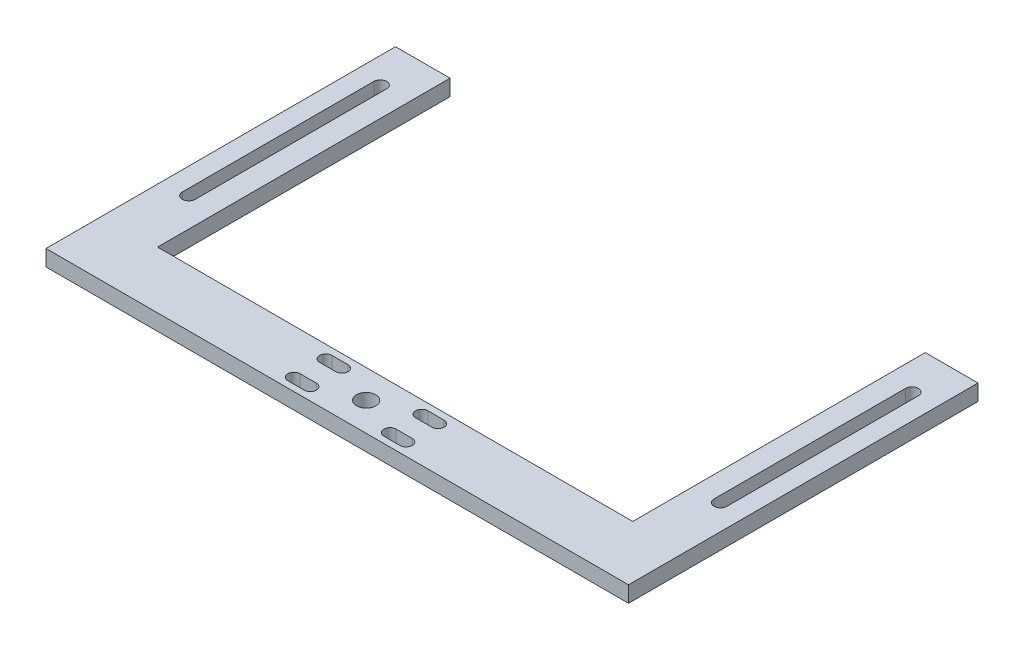
ISO-10303-21;
HEADER;
FILE_DESCRIPTION(('STEP AP214'),'2;1');
FILE_NAME('part.step','',(''),(''),'','','');
FILE_SCHEMA(('AUTOMOTIVE_DESIGN { 1 0 10303 214 1 1 1 1 }'));
ENDSEC;
DATA;
#1=APPLICATION_CONTEXT('core data for automotive mechanical design processes');
#2=APPLICATION_PROTOCOL_DEFINITION('international standard','automotive_design',2000,#1);
#3=PRODUCT_CONTEXT('',#1,'mechanical');
#4=PRODUCT('Part','Part','',(#3));
#5=PRODUCT_RELATED_PRODUCT_CATEGORY('part','',(#4));
#6=PRODUCT_DEFINITION_FORMATION('','',#4);
#7=PRODUCT_DEFINITION_CONTEXT('part definition',#1,'design');
#8=PRODUCT_DEFINITION('design','',#6,#7);
#9=PRODUCT_DEFINITION_SHAPE('','',#8);
#10=(LENGTH_UNIT() NAMED_UNIT(*) SI_UNIT(.MILLI.,.METRE.));
#11=(NAMED_UNIT(*) PLANE_ANGLE_UNIT() SI_UNIT($,.RADIAN.));
#12=(NAMED_UNIT(*) SI_UNIT($,.STERADIAN.) SOLID_ANGLE_UNIT());
#13=UNCERTAINTY_MEASURE_WITH_UNIT(LENGTH_MEASURE(1.E-05),#10,'distance_accuracy_value','');
#14=(GEOMETRIC_REPRESENTATION_CONTEXT(3) GLOBAL_UNCERTAINTY_ASSIGNED_CONTEXT((#13)) GLOBAL_UNIT_ASSIGNED_CONTEXT((#10,
#11,#12)) REPRESENTATION_CONTEXT('',''));
#15=CARTESIAN_POINT('',(0.,0.,0.));
#16=DIRECTION('',(0.,0.,1.));
#17=DIRECTION('',(1.,0.,0.));
#18=AXIS2_PLACEMENT_3D('',#15,#16,#17);
#19=CARTESIAN_POINT('',(0.,5.,36.5015102822945));
#20=DIRECTION('',(0.,0.,-1.));
#21=DIRECTION('',(-1.,0.,0.));
#22=AXIS2_PLACEMENT_3D('',#19,#20,#21);
#23=PLANE('',#22);
#24=DIRECTION('',(1.,0.,0.));
#25=VECTOR('',#24,1.);
#26=CARTESIAN_POINT('',(0.,0.,36.5015102822945));
#27=LINE('',#26,#25);
#28=CARTESIAN_POINT('',(-103.043555275164,0.,36.5015102822945));
#29=VERTEX_POINT('',#28);
#30=CARTESIAN_POINT('',(78.4778435266556,0.,36.5015102822945));
#31=VERTEX_POINT('',#30);
#32=EDGE_CURVE('E468',#29,#31,#27,.T.);
#33=ORIENTED_EDGE('',*,*,#32,.T.);
#34=DIRECTION('',(0.,-1.,0.));
#35=VECTOR('',#34,1.);
#36=CARTESIAN_POINT('',(78.4778435266556,5.,36.5015102822945));
#37=LINE('',#36,#35);
#38=CARTESIAN_POINT('',(78.4778435266556,5.,36.5015102822945));
#39=VERTEX_POINT('',#38);
#40=EDGE_CURVE('E344',#39,#31,#37,.T.);
#41=ORIENTED_EDGE('',*,*,#40,.F.);
#42=DIRECTION('',(1.,0.,0.));
#43=VECTOR('',#42,1.);
#44=CARTESIAN_POINT('',(0.,5.,36.5015102822945));
#45=LINE('',#44,#43);
#46=CARTESIAN_POINT('',(-103.043555275164,5.,36.5015102822945));
#47=VERTEX_POINT('',#46);
#48=EDGE_CURVE('E427',#47,#39,#45,.T.);
#49=ORIENTED_EDGE('',*,*,#48,.F.);
#50=DIRECTION('',(0.,-1.,0.));
#51=VECTOR('',#50,1.);
#52=CARTESIAN_POINT('',(-103.043555275164,5.,36.5015102822945));
#53=LINE('',#52,#51);
#54=EDGE_CURVE('E387',#47,#29,#53,.T.);
#55=ORIENTED_EDGE('',*,*,#54,.T.);
#56=EDGE_LOOP('',(#33,#41,#49,#55));
#57=FACE_BOUND('',#56,.T.);
#58=ADVANCED_FACE('F95',(#57),#23,.F.);
#59=CARTESIAN_POINT('',(-12.1835686365529,5.,27.5951584174138));
#60=DIRECTION('',(0.,-1.,0.));
#61=DIRECTION('',(0.,0.,-1.));
#62=AXIS2_PLACEMENT_3D('',#59,#60,#61);
#63=CYLINDRICAL_SURFACE('',#62,3.);
#64=CARTESIAN_POINT('',(-12.1835686365529,5.,27.5951584174138));
#65=DIRECTION('',(0.,1.,0.));
#66=DIRECTION('',(0.,0.,1.));
#67=AXIS2_PLACEMENT_3D('',#64,#65,#66);
#68=CIRCLE('',#67,3.);
#69=CARTESIAN_POINT('',(-12.1835686365529,5.,30.5951584174139));
#70=VERTEX_POINT('',#69);
#71=EDGE_CURVE('E549',#70,#70,#68,.T.);
#72=ORIENTED_EDGE('',*,*,#71,.T.);
#73=EDGE_LOOP('',(#72));
#74=FACE_BOUND('',#73,.T.);
#75=CARTESIAN_POINT('',(-12.1835686365529,0.,27.5951584174138));
#76=DIRECTION('',(0.,1.,0.));
#77=DIRECTION('',(0.,0.,1.));
#78=AXIS2_PLACEMENT_3D('',#75,#76,#77);
#79=CIRCLE('',#78,3.);
#80=CARTESIAN_POINT('',(-12.1835686365529,0.,30.5951584174139));
#81=VERTEX_POINT('',#80);
#82=EDGE_CURVE('E476',#81,#81,#79,.T.);
#83=ORIENTED_EDGE('',*,*,#82,.F.);
#84=EDGE_LOOP('',(#83));
#85=FACE_BOUND('',#84,.T.);
#86=ADVANCED_FACE('F730',(#74,#85),#63,.F.);
#87=CARTESIAN_POINT('',(0.,5.,20.8098805284228));
#88=DIRECTION('',(0.,0.,-1.));
#89=DIRECTION('',(-1.,0.,0.));
#90=AXIS2_PLACEMENT_3D('',#87,#88,#89);
#91=PLANE('',#90);
#92=DIRECTION('',(1.,0.,0.));
#93=VECTOR('',#92,1.);
#94=CARTESIAN_POINT('',(0.,0.,20.8098805284228));
#95=LINE('',#94,#93);
#96=CARTESIAN_POINT('',(-29.6663123654557,0.,20.8098805284228));
#97=VERTEX_POINT('',#96);
#98=CARTESIAN_POINT('',(-24.5966822269551,0.,20.8098805284228));
#99=VERTEX_POINT('',#98);
#100=EDGE_CURVE('E480',#97,#99,#95,.T.);
#101=ORIENTED_EDGE('',*,*,#100,.T.);
#102=DIRECTION('',(0.,-1.,0.));
#103=VECTOR('',#102,1.);
#104=CARTESIAN_POINT('',(-24.5966822269551,5.,20.8098805284228));
#105=LINE('',#104,#103);
#106=CARTESIAN_POINT('',(-24.5966822269551,5.,20.8098805284228));
#107=VERTEX_POINT('',#106);
#108=EDGE_CURVE('E443',#107,#99,#105,.T.);
#109=ORIENTED_EDGE('',*,*,#108,.F.);
#110=DIRECTION('',(1.,0.,0.));
#111=VECTOR('',#110,1.);
#112=CARTESIAN_POINT('',(0.,5.,20.8098805284228));
#113=LINE('',#112,#111);
#114=CARTESIAN_POINT('',(-29.6663123654557,5.,20.8098805284228));
#115=VERTEX_POINT('',#114);
#116=EDGE_CURVE('E553',#115,#107,#113,.T.);
#117=ORIENTED_EDGE('',*,*,#116,.F.);
#118=DIRECTION('',(0.,-1.,0.));
#119=VECTOR('',#118,1.);
#120=CARTESIAN_POINT('',(-29.6663123654557,5.,20.8098805284228));
#121=LINE('',#120,#119);
#122=EDGE_CURVE('E459',#115,#97,#121,.T.);
#123=ORIENTED_EDGE('',*,*,#122,.T.);
#124=EDGE_LOOP('',(#101,#109,#117,#123));
#125=FACE_BOUND('',#124,.T.);
#126=ADVANCED_FACE('F733',(#125),#91,.F.);
#127=CARTESIAN_POINT('',(-29.6663123654557,5.,22.7104109484229));
#128=DIRECTION('',(0.,-1.,0.));
#129=DIRECTION('',(0.,0.,-1.));
#130=AXIS2_PLACEMENT_3D('',#127,#128,#129);
#131=CYLINDRICAL_SURFACE('',#130,1.90053042);
#132=CARTESIAN_POINT('',(-29.6663123654557,0.,22.7104109484229));
#133=DIRECTION('',(0.,1.,0.));
#134=DIRECTION('',(0.,0.,1.));
#135=AXIS2_PLACEMENT_3D('',#132,#133,#134);
#136=CIRCLE('',#135,1.90053042);
#137=CARTESIAN_POINT('',(-29.6663123654557,0.,24.6109413684229));
#138=VERTEX_POINT('',#137);
#139=EDGE_CURVE('E484',#97,#138,#136,.T.);
#140=ORIENTED_EDGE('',*,*,#139,.F.);
#141=ORIENTED_EDGE('',*,*,#122,.F.);
#142=CARTESIAN_POINT('',(-29.6663123654557,5.,22.7104109484229));
#143=DIRECTION('',(0.,1.,0.));
#144=DIRECTION('',(0.,0.,1.));
#145=AXIS2_PLACEMENT_3D('',#142,#143,#144);
#146=CIRCLE('',#145,1.90053042);
#147=CARTESIAN_POINT('',(-29.6663123654557,5.,24.6109413684229));
#148=VERTEX_POINT('',#147);
#149=EDGE_CURVE('E556',#115,#148,#146,.T.);
#150=ORIENTED_EDGE('',*,*,#149,.T.);
#151=DIRECTION('',(0.,-1.,0.));
#152=VECTOR('',#151,1.);
#153=CARTESIAN_POINT('',(-29.6663123654557,5.,24.6109413684229));
#154=LINE('',#153,#152);
#155=EDGE_CURVE('E456',#148,#138,#154,.T.);
#156=ORIENTED_EDGE('',*,*,#155,.T.);
#157=EDGE_LOOP('',(#140,#141,#150,#156));
#158=FACE_BOUND('',#157,.T.);
#159=ADVANCED_FACE('F737',(#158),#131,.F.);
#160=CARTESIAN_POINT('',(0.,5.,24.6109413684229));
#161=DIRECTION('',(0.,0.,-1.));
#162=DIRECTION('',(-1.,0.,0.));
#163=AXIS2_PLACEMENT_3D('',#160,#161,#162);
#164=PLANE('',#163);
#165=DIRECTION('',(1.,0.,0.));
#166=VECTOR('',#165,1.);
#167=CARTESIAN_POINT('',(0.,0.,24.6109413684229));
#168=LINE('',#167,#166);
#169=CARTESIAN_POINT('',(-24.5966822269551,0.,24.6109413684229));
#170=VERTEX_POINT('',#169);
#171=EDGE_CURVE('E488',#138,#170,#168,.T.);
#172=ORIENTED_EDGE('',*,*,#171,.F.);
#173=ORIENTED_EDGE('',*,*,#155,.F.);
#174=DIRECTION('',(1.,0.,0.));
#175=VECTOR('',#174,1.);
#176=CARTESIAN_POINT('',(0.,5.,24.6109413684229));
#177=LINE('',#176,#175);
#178=CARTESIAN_POINT('',(-24.5966822269551,5.,24.6109413684229));
#179=VERTEX_POINT('',#178);
#180=EDGE_CURVE('E560',#148,#179,#177,.T.);
#181=ORIENTED_EDGE('',*,*,#180,.T.);
#182=DIRECTION('',(0.,-1.,0.));
#183=VECTOR('',#182,1.);
#184=CARTESIAN_POINT('',(-24.5966822269551,5.,24.6109413684229));
#185=LINE('',#184,#183);
#186=EDGE_CURVE('E452',#179,#170,#185,.T.);
#187=ORIENTED_EDGE('',*,*,#186,.T.);
#188=EDGE_LOOP('',(#172,#173,#181,#187));
#189=FACE_BOUND('',#188,.T.);
#190=ADVANCED_FACE('F741',(#189),#164,.T.);
#191=CARTESIAN_POINT('',(-24.5966822269551,5.,22.7104109484229));
#192=DIRECTION('',(0.,-1.,0.));
#193=DIRECTION('',(0.,0.,-1.));
#194=AXIS2_PLACEMENT_3D('',#191,#192,#193);
#195=CYLINDRICAL_SURFACE('',#194,1.90053042);
#196=CARTESIAN_POINT('',(-24.5966822269551,0.,22.7104109484229));
#197=DIRECTION('',(0.,1.,0.));
#198=DIRECTION('',(0.,0.,1.));
#199=AXIS2_PLACEMENT_3D('',#196,#197,#198);
#200=CIRCLE('',#199,1.90053042);
#201=EDGE_CURVE('E492',#170,#99,#200,.T.);
#202=ORIENTED_EDGE('',*,*,#201,.F.);
#203=ORIENTED_EDGE('',*,*,#186,.F.);
#204=CARTESIAN_POINT('',(-24.5966822269551,5.,22.7104109484229));
#205=DIRECTION('',(0.,1.,0.));
#206=DIRECTION('',(0.,0.,1.));
#207=AXIS2_PLACEMENT_3D('',#204,#205,#206);
#208=CIRCLE('',#207,1.90053042);
#209=EDGE_CURVE('E564',#179,#107,#208,.T.);
#210=ORIENTED_EDGE('',*,*,#209,.T.);
#211=ORIENTED_EDGE('',*,*,#108,.T.);
#212=EDGE_LOOP('',(#202,#203,#210,#211));
#213=FACE_BOUND('',#212,.T.);
#214=ADVANCED_FACE('F745',(#213),#195,.F.);
#215=CARTESIAN_POINT('',(0.,5.,30.7093754650346));
#216=DIRECTION('',(0.,0.,-1.));
#217=DIRECTION('',(-1.,0.,0.));
#218=AXIS2_PLACEMENT_3D('',#215,#216,#217);
#219=PLANE('',#218);
#220=DIRECTION('',(1.,0.,0.));
#221=VECTOR('',#220,1.);
#222=CARTESIAN_POINT('',(0.,0.,30.7093754650346));
#223=LINE('',#222,#221);
#224=CARTESIAN_POINT('',(-29.666312365455,0.,30.7093754650346));
#225=VERTEX_POINT('',#224);
#226=CARTESIAN_POINT('',(-24.5966822269544,0.,30.7093754650346));
#227=VERTEX_POINT('',#226);
#228=EDGE_CURVE('E496',#225,#227,#223,.T.);
#229=ORIENTED_EDGE('',*,*,#228,.T.);
#230=DIRECTION('',(0.,-1.,0.));
#231=VECTOR('',#230,1.);
#232=CARTESIAN_POINT('',(-24.5966822269544,5.,30.7093754650346));
#233=LINE('',#232,#231);
#234=CARTESIAN_POINT('',(-24.5966822269544,5.,30.7093754650346));
#235=VERTEX_POINT('',#234);
#236=EDGE_CURVE('E431',#235,#227,#233,.T.);
#237=ORIENTED_EDGE('',*,*,#236,.F.);
#238=DIRECTION('',(1.,0.,0.));
#239=VECTOR('',#238,1.);
#240=CARTESIAN_POINT('',(0.,5.,30.7093754650346));
#241=LINE('',#240,#239);
#242=CARTESIAN_POINT('',(-29.666312365455,5.,30.7093754650346));
#243=VERTEX_POINT('',#242);
#244=EDGE_CURVE('E568',#243,#235,#241,.T.);
#245=ORIENTED_EDGE('',*,*,#244,.F.);
#246=DIRECTION('',(0.,-1.,0.));
#247=VECTOR('',#246,1.);
#248=CARTESIAN_POINT('',(-29.666312365455,5.,30.7093754650346));
#249=LINE('',#248,#247);
#250=EDGE_CURVE('E447',#243,#225,#249,.T.);
#251=ORIENTED_EDGE('',*,*,#250,.T.);
#252=EDGE_LOOP('',(#229,#237,#245,#251));
#253=FACE_BOUND('',#252,.T.);
#254=ADVANCED_FACE('F749',(#253),#219,.F.);
#255=CARTESIAN_POINT('',(-29.666312365455,5.,32.6093754650345));
#256=DIRECTION('',(0.,-1.,0.));
#257=DIRECTION('',(0.,0.,-1.));
#258=AXIS2_PLACEMENT_3D('',#255,#256,#257);
#259=CYLINDRICAL_SURFACE('',#258,1.9);
#260=CARTESIAN_POINT('',(-29.666312365455,0.,32.6093754650345));
#261=DIRECTION('',(0.,1.,0.));
#262=DIRECTION('',(0.,0.,1.));
#263=AXIS2_PLACEMENT_3D('',#260,#261,#262);
#264=CIRCLE('',#263,1.9);
#265=CARTESIAN_POINT('',(-29.666312365455,0.,34.5093754650345));
#266=VERTEX_POINT('',#265);
#267=EDGE_CURVE('E500',#225,#266,#264,.T.);
#268=ORIENTED_EDGE('',*,*,#267,.F.);
#269=ORIENTED_EDGE('',*,*,#250,.F.);
#270=CARTESIAN_POINT('',(-29.666312365455,5.,32.6093754650345));
#271=DIRECTION('',(0.,1.,0.));
#272=DIRECTION('',(0.,0.,1.));
#273=AXIS2_PLACEMENT_3D('',#270,#271,#272);
#274=CIRCLE('',#273,1.9);
#275=CARTESIAN_POINT('',(-29.666312365455,5.,34.5093754650345));
#276=VERTEX_POINT('',#275);
#277=EDGE_CURVE('E571',#243,#276,#274,.T.);
#278=ORIENTED_EDGE('',*,*,#277,.T.);
#279=DIRECTION('',(0.,-1.,0.));
#280=VECTOR('',#279,1.);
#281=CARTESIAN_POINT('',(-29.666312365455,5.,34.5093754650345));
#282=LINE('',#281,#280);
#283=EDGE_CURVE('E444',#276,#266,#282,.T.);
#284=ORIENTED_EDGE('',*,*,#283,.T.);
#285=EDGE_LOOP('',(#268,#269,#278,#284));
#286=FACE_BOUND('',#285,.T.);
#287=ADVANCED_FACE('F753',(#286),#259,.F.);
#288=CARTESIAN_POINT('',(0.,5.,34.5093754650345));
#289=DIRECTION('',(0.,0.,-1.));
#290=DIRECTION('',(-1.,0.,0.));
#291=AXIS2_PLACEMENT_3D('',#288,#289,#290);
#292=PLANE('',#291);
#293=DIRECTION('',(1.,0.,0.));
#294=VECTOR('',#293,1.);
#295=CARTESIAN_POINT('',(0.,0.,34.5093754650345));
#296=LINE('',#295,#294);
#297=CARTESIAN_POINT('',(-24.5966822269544,0.,34.5093754650345));
#298=VERTEX_POINT('',#297);
#299=EDGE_CURVE('E504',#266,#298,#296,.T.);
#300=ORIENTED_EDGE('',*,*,#299,.F.);
#301=ORIENTED_EDGE('',*,*,#283,.F.);
#302=DIRECTION('',(1.,0.,0.));
#303=VECTOR('',#302,1.);
#304=CARTESIAN_POINT('',(0.,5.,34.5093754650345));
#305=LINE('',#304,#303);
#306=CARTESIAN_POINT('',(-24.5966822269544,5.,34.5093754650345));
#307=VERTEX_POINT('',#306);
#308=EDGE_CURVE('E575',#276,#307,#305,.T.);
#309=ORIENTED_EDGE('',*,*,#308,.T.);
#310=DIRECTION('',(0.,-1.,0.));
#311=VECTOR('',#310,1.);
#312=CARTESIAN_POINT('',(-24.5966822269544,5.,34.5093754650345));
#313=LINE('',#312,#311);
#314=EDGE_CURVE('E440',#307,#298,#313,.T.);
#315=ORIENTED_EDGE('',*,*,#314,.T.);
#316=EDGE_LOOP('',(#300,#301,#309,#315));
#317=FACE_BOUND('',#316,.T.);
#318=ADVANCED_FACE('F757',(#317),#292,.T.);
#319=CARTESIAN_POINT('',(-24.5966822269544,5.,32.6093754650345));
#320=DIRECTION('',(0.,-1.,0.));
#321=DIRECTION('',(0.,0.,-1.));
#322=AXIS2_PLACEMENT_3D('',#319,#320,#321);
#323=CYLINDRICAL_SURFACE('',#322,1.9);
#324=CARTESIAN_POINT('',(-24.5966822269544,0.,32.6093754650345));
#325=DIRECTION('',(0.,1.,0.));
#326=DIRECTION('',(0.,0.,1.));
#327=AXIS2_PLACEMENT_3D('',#324,#325,#326);
#328=CIRCLE('',#327,1.9);
#329=EDGE_CURVE('E508',#298,#227,#328,.T.);
#330=ORIENTED_EDGE('',*,*,#329,.F.);
#331=ORIENTED_EDGE('',*,*,#314,.F.);
#332=CARTESIAN_POINT('',(-24.5966822269544,5.,32.6093754650345));
#333=DIRECTION('',(0.,1.,0.));
#334=DIRECTION('',(0.,0.,1.));
#335=AXIS2_PLACEMENT_3D('',#332,#333,#334);
#336=CIRCLE('',#335,1.9);
#337=EDGE_CURVE('E579',#307,#235,#336,.T.);
#338=ORIENTED_EDGE('',*,*,#337,.T.);
#339=ORIENTED_EDGE('',*,*,#236,.T.);
#340=EDGE_LOOP('',(#330,#331,#338,#339));
#341=FACE_BOUND('',#340,.T.);
#342=ADVANCED_FACE('F761',(#341),#323,.F.);
#343=CARTESIAN_POINT('',(0.,5.,20.809880528422));
#344=DIRECTION('',(0.,0.,-1.));
#345=DIRECTION('',(-1.,0.,0.));
#346=AXIS2_PLACEMENT_3D('',#343,#344,#345);
#347=PLANE('',#346);
#348=DIRECTION('',(1.,0.,0.));
#349=VECTOR('',#348,1.);
#350=CARTESIAN_POINT('',(0.,0.,20.809880528422));
#351=LINE('',#350,#349);
#352=CARTESIAN_POINT('',(0.23318257115589,0.,20.809880528422));
#353=VERTEX_POINT('',#352);
#354=CARTESIAN_POINT('',(5.3028127096565,0.,20.809880528422));
#355=VERTEX_POINT('',#354);
#356=EDGE_CURVE('E512',#353,#355,#351,.T.);
#357=ORIENTED_EDGE('',*,*,#356,.T.);
#358=DIRECTION('',(0.,-1.,0.));
#359=VECTOR('',#358,1.);
#360=CARTESIAN_POINT('',(5.3028127096565,5.,20.809880528422));
#361=LINE('',#360,#359);
#362=CARTESIAN_POINT('',(5.3028127096565,5.,20.809880528422));
#363=VERTEX_POINT('',#362);
#364=EDGE_CURVE('E417',#363,#355,#361,.T.);
#365=ORIENTED_EDGE('',*,*,#364,.F.);
#366=DIRECTION('',(1.,0.,0.));
#367=VECTOR('',#366,1.);
#368=CARTESIAN_POINT('',(0.,5.,20.809880528422));
#369=LINE('',#368,#367);
#370=CARTESIAN_POINT('',(0.23318257115589,5.,20.809880528422));
#371=VERTEX_POINT('',#370);
#372=EDGE_CURVE('E583',#371,#363,#369,.T.);
#373=ORIENTED_EDGE('',*,*,#372,.F.);
#374=DIRECTION('',(0.,-1.,0.));
#375=VECTOR('',#374,1.);
#376=CARTESIAN_POINT('',(0.23318257115589,5.,20.809880528422));
#377=LINE('',#376,#375);
#378=EDGE_CURVE('E435',#371,#353,#377,.T.);
#379=ORIENTED_EDGE('',*,*,#378,.T.);
#380=EDGE_LOOP('',(#357,#365,#373,#379));
#381=FACE_BOUND('',#380,.T.);
#382=ADVANCED_FACE('F765',(#381),#347,.F.);
#383=CARTESIAN_POINT('',(0.23318257115589,5.,22.709880528422));
#384=DIRECTION('',(0.,-1.,0.));
#385=DIRECTION('',(0.,0.,-1.));
#386=AXIS2_PLACEMENT_3D('',#383,#384,#385);
#387=CYLINDRICAL_SURFACE('',#386,1.9);
#388=CARTESIAN_POINT('',(0.23318257115589,0.,22.709880528422));
#389=DIRECTION('',(0.,1.,0.));
#390=DIRECTION('',(0.,0.,1.));
#391=AXIS2_PLACEMENT_3D('',#388,#389,#390);
#392=CIRCLE('',#391,1.9);
#393=CARTESIAN_POINT('',(0.23318257115589,0.,24.609880528422));
#394=VERTEX_POINT('',#393);
#395=EDGE_CURVE('E516',#353,#394,#392,.T.);
#396=ORIENTED_EDGE('',*,*,#395,.F.);
#397=ORIENTED_EDGE('',*,*,#378,.F.);
#398=CARTESIAN_POINT('',(0.23318257115589,5.,22.709880528422));
#399=DIRECTION('',(0.,1.,0.));
#400=DIRECTION('',(0.,0.,1.));
#401=AXIS2_PLACEMENT_3D('',#398,#399,#400);
#402=CIRCLE('',#401,1.9);
#403=CARTESIAN_POINT('',(0.23318257115589,5.,24.609880528422));
#404=VERTEX_POINT('',#403);
#405=EDGE_CURVE('E586',#371,#404,#402,.T.);
#406=ORIENTED_EDGE('',*,*,#405,.T.);
#407=DIRECTION('',(0.,-1.,0.));
#408=VECTOR('',#407,1.);
#409=CARTESIAN_POINT('',(0.23318257115589,5.,24.609880528422));
#410=LINE('',#409,#408);
#411=EDGE_CURVE('E432',#404,#394,#410,.T.);
#412=ORIENTED_EDGE('',*,*,#411,.T.);
#413=EDGE_LOOP('',(#396,#397,#406,#412));
#414=FACE_BOUND('',#413,.T.);
#415=ADVANCED_FACE('F769',(#414),#387,.F.);
#416=CARTESIAN_POINT('',(0.,5.,24.609880528422));
#417=DIRECTION('',(0.,0.,-1.));
#418=DIRECTION('',(-1.,0.,0.));
#419=AXIS2_PLACEMENT_3D('',#416,#417,#418);
#420=PLANE('',#419);
#421=DIRECTION('',(1.,0.,0.));
#422=VECTOR('',#421,1.);
#423=CARTESIAN_POINT('',(0.,0.,24.609880528422));
#424=LINE('',#423,#422);
#425=CARTESIAN_POINT('',(5.3028127096565,0.,24.609880528422));
#426=VERTEX_POINT('',#425);
#427=EDGE_CURVE('E520',#394,#426,#424,.T.);
#428=ORIENTED_EDGE('',*,*,#427,.F.);
#429=ORIENTED_EDGE('',*,*,#411,.F.);
#430=DIRECTION('',(1.,0.,0.));
#431=VECTOR('',#430,1.);
#432=CARTESIAN_POINT('',(0.,5.,24.609880528422));
#433=LINE('',#432,#431);
#434=CARTESIAN_POINT('',(5.3028127096565,5.,24.609880528422));
#435=VERTEX_POINT('',#434);
#436=EDGE_CURVE('E590',#404,#435,#433,.T.);
#437=ORIENTED_EDGE('',*,*,#436,.T.);
#438=DIRECTION('',(0.,-1.,0.));
#439=VECTOR('',#438,1.);
#440=CARTESIAN_POINT('',(5.3028127096565,5.,24.609880528422));
#441=LINE('',#440,#439);
#442=EDGE_CURVE('E428',#435,#426,#441,.T.);
#443=ORIENTED_EDGE('',*,*,#442,.T.);
#444=EDGE_LOOP('',(#428,#429,#437,#443));
#445=FACE_BOUND('',#444,.T.);
#446=ADVANCED_FACE('F773',(#445),#420,.T.);
#447=CARTESIAN_POINT('',(5.3028127096565,5.,22.709880528422));
#448=DIRECTION('',(0.,-1.,0.));
#449=DIRECTION('',(0.,0.,-1.));
#450=AXIS2_PLACEMENT_3D('',#447,#448,#449);
#451=CYLINDRICAL_SURFACE('',#450,1.9);
#452=CARTESIAN_POINT('',(5.3028127096565,0.,22.709880528422));
#453=DIRECTION('',(0.,1.,0.));
#454=DIRECTION('',(0.,0.,1.));
#455=AXIS2_PLACEMENT_3D('',#452,#453,#454);
#456=CIRCLE('',#455,1.9);
#457=EDGE_CURVE('E524',#426,#355,#456,.T.);
#458=ORIENTED_EDGE('',*,*,#457,.F.);
#459=ORIENTED_EDGE('',*,*,#442,.F.);
#460=CARTESIAN_POINT('',(5.3028127096565,5.,22.709880528422));
#461=DIRECTION('',(0.,1.,0.));
#462=DIRECTION('',(0.,0.,1.));
#463=AXIS2_PLACEMENT_3D('',#460,#461,#462);
#464=CIRCLE('',#463,1.9);
#465=EDGE_CURVE('E594',#435,#363,#464,.T.);
#466=ORIENTED_EDGE('',*,*,#465,.T.);
#467=ORIENTED_EDGE('',*,*,#364,.T.);
#468=EDGE_LOOP('',(#458,#459,#466,#467));
#469=FACE_BOUND('',#468,.T.);
#470=ADVANCED_FACE('F777',(#469),#451,.F.);
#471=CARTESIAN_POINT('',(0.,5.,30.7093754650337));
#472=DIRECTION('',(0.,0.,-1.));
#473=DIRECTION('',(-1.,0.,0.));
#474=AXIS2_PLACEMENT_3D('',#471,#472,#473);
#475=PLANE('',#474);
#476=DIRECTION('',(1.,0.,0.));
#477=VECTOR('',#476,1.);
#478=CARTESIAN_POINT('',(0.,0.,30.7093754650337));
#479=LINE('',#478,#477);
#480=CARTESIAN_POINT('',(0.233182571156695,0.,30.7093754650337));
#481=VERTEX_POINT('',#480);
#482=CARTESIAN_POINT('',(5.30281270965731,0.,30.7093754650337));
#483=VERTEX_POINT('',#482);
#484=EDGE_CURVE('E528',#481,#483,#479,.T.);
#485=ORIENTED_EDGE('',*,*,#484,.T.);
#486=DIRECTION('',(0.,-1.,0.));
#487=VECTOR('',#486,1.);
#488=CARTESIAN_POINT('',(5.30281270965731,5.,30.7093754650337));
#489=LINE('',#488,#487);
#490=CARTESIAN_POINT('',(5.30281270965731,5.,30.7093754650337));
#491=VERTEX_POINT('',#490);
#492=EDGE_CURVE('E424',#491,#483,#489,.T.);
#493=ORIENTED_EDGE('',*,*,#492,.F.);
#494=DIRECTION('',(1.,0.,0.));
#495=VECTOR('',#494,1.);
#496=CARTESIAN_POINT('',(0.,5.,30.7093754650337));
#497=LINE('',#496,#495);
#498=CARTESIAN_POINT('',(0.233182571156695,5.,30.7093754650337));
#499=VERTEX_POINT('',#498);
#500=EDGE_CURVE('E598',#499,#491,#497,.T.);
#501=ORIENTED_EDGE('',*,*,#500,.F.);
#502=DIRECTION('',(0.,-1.,0.));
#503=VECTOR('',#502,1.);
#504=CARTESIAN_POINT('',(0.233182571156695,5.,30.7093754650337));
#505=LINE('',#504,#503);
#506=EDGE_CURVE('E421',#499,#481,#505,.T.);
#507=ORIENTED_EDGE('',*,*,#506,.T.);
#508=EDGE_LOOP('',(#485,#493,#501,#507));
#509=FACE_BOUND('',#508,.T.);
#510=ADVANCED_FACE('F781',(#509),#475,.F.);
#511=CARTESIAN_POINT('',(0.233182571156695,5.,32.6093754650337));
#512=DIRECTION('',(0.,-1.,0.));
#513=DIRECTION('',(0.,0.,-1.));
#514=AXIS2_PLACEMENT_3D('',#511,#512,#513);
#515=CYLINDRICAL_SURFACE('',#514,1.9);
#516=CARTESIAN_POINT('',(0.233182571156695,0.,32.6093754650337));
#517=DIRECTION('',(0.,1.,0.));
#518=DIRECTION('',(0.,0.,1.));
#519=AXIS2_PLACEMENT_3D('',#516,#517,#518);
#520=CIRCLE('',#519,1.9);
#521=CARTESIAN_POINT('',(0.233182571156695,0.,34.5093754650337));
#522=VERTEX_POINT('',#521);
#523=EDGE_CURVE('E532',#481,#522,#520,.T.);
#524=ORIENTED_EDGE('',*,*,#523,.F.);
#525=ORIENTED_EDGE('',*,*,#506,.F.);
#526=CARTESIAN_POINT('',(0.233182571156695,5.,32.6093754650337));
#527=DIRECTION('',(0.,1.,0.));
#528=DIRECTION('',(0.,0.,1.));
#529=AXIS2_PLACEMENT_3D('',#526,#527,#528);
#530=CIRCLE('',#529,1.9);
#531=CARTESIAN_POINT('',(0.233182571156695,5.,34.5093754650337));
#532=VERTEX_POINT('',#531);
#533=EDGE_CURVE('E601',#499,#532,#530,.T.);
#534=ORIENTED_EDGE('',*,*,#533,.T.);
#535=DIRECTION('',(0.,-1.,0.));
#536=VECTOR('',#535,1.);
#537=CARTESIAN_POINT('',(0.233182571156695,5.,34.5093754650337));
#538=LINE('',#537,#536);
#539=EDGE_CURVE('E418',#532,#522,#538,.T.);
#540=ORIENTED_EDGE('',*,*,#539,.T.);
#541=EDGE_LOOP('',(#524,#525,#534,#540));
#542=FACE_BOUND('',#541,.T.);
#543=ADVANCED_FACE('F785',(#542),#515,.F.);
#544=CARTESIAN_POINT('',(0.,5.,34.5093754650337));
#545=DIRECTION('',(0.,0.,-1.));
#546=DIRECTION('',(-1.,0.,0.));
#547=AXIS2_PLACEMENT_3D('',#544,#545,#546);
#548=PLANE('',#547);
#549=DIRECTION('',(1.,0.,0.));
#550=VECTOR('',#549,1.);
#551=CARTESIAN_POINT('',(0.,0.,34.5093754650337));
#552=LINE('',#551,#550);
#553=CARTESIAN_POINT('',(5.30281270965731,0.,34.5093754650337));
#554=VERTEX_POINT('',#553);
#555=EDGE_CURVE('E536',#522,#554,#552,.T.);
#556=ORIENTED_EDGE('',*,*,#555,.F.);
#557=ORIENTED_EDGE('',*,*,#539,.F.);
#558=DIRECTION('',(1.,0.,0.));
#559=VECTOR('',#558,1.);
#560=CARTESIAN_POINT('',(0.,5.,34.5093754650337));
#561=LINE('',#560,#559);
#562=CARTESIAN_POINT('',(5.30281270965731,5.,34.5093754650337));
#563=VERTEX_POINT('',#562);
#564=EDGE_CURVE('E605',#532,#563,#561,.T.);
#565=ORIENTED_EDGE('',*,*,#564,.T.);
#566=DIRECTION('',(0.,-1.,0.));
#567=VECTOR('',#566,1.);
#568=CARTESIAN_POINT('',(5.30281270965731,5.,34.5093754650337));
#569=LINE('',#568,#567);
#570=EDGE_CURVE('E414',#563,#554,#569,.T.);
#571=ORIENTED_EDGE('',*,*,#570,.T.);
#572=EDGE_LOOP('',(#556,#557,#565,#571));
#573=FACE_BOUND('',#572,.T.);
#574=ADVANCED_FACE('F789',(#573),#548,.T.);
#575=CARTESIAN_POINT('',(5.30281270965731,5.,32.6093754650337));
#576=DIRECTION('',(0.,-1.,0.));
#577=DIRECTION('',(0.,0.,-1.));
#578=AXIS2_PLACEMENT_3D('',#575,#576,#577);
#579=CYLINDRICAL_SURFACE('',#578,1.9);
#580=CARTESIAN_POINT('',(5.30281270965731,0.,32.6093754650337));
#581=DIRECTION('',(0.,1.,0.));
#582=DIRECTION('',(0.,0.,1.));
#583=AXIS2_PLACEMENT_3D('',#580,#581,#582);
#584=CIRCLE('',#583,1.9);
#585=EDGE_CURVE('E383',#554,#483,#584,.T.);
#586=ORIENTED_EDGE('',*,*,#585,.F.);
#587=ORIENTED_EDGE('',*,*,#570,.F.);
#588=CARTESIAN_POINT('',(5.30281270965731,5.,32.6093754650337));
#589=DIRECTION('',(0.,1.,0.));
#590=DIRECTION('',(0.,0.,1.));
#591=AXIS2_PLACEMENT_3D('',#588,#589,#590);
#592=CIRCLE('',#591,1.9);
#593=EDGE_CURVE('E471',#563,#491,#592,.T.);
#594=ORIENTED_EDGE('',*,*,#593,.T.);
#595=ORIENTED_EDGE('',*,*,#492,.T.);
#596=EDGE_LOOP('',(#586,#587,#594,#595));
#597=FACE_BOUND('',#596,.T.);
#598=ADVANCED_FACE('F793',(#597),#579,.F.);
#599=CARTESIAN_POINT('',(0.,5.,0.));
#600=DIRECTION('',(0.,1.,0.));
#601=DIRECTION('',(0.,0.,1.));
#602=AXIS2_PLACEMENT_3D('',#599,#600,#601);
#603=PLANE('',#602);
#604=CARTESIAN_POINT('',(70.637966918447,5.,-59.6693943002321));
#605=DIRECTION('',(0.,1.,0.));
#606=DIRECTION('',(0.,0.,1.));
#607=AXIS2_PLACEMENT_3D('',#604,#605,#606);
#608=CIRCLE('',#607,2.);
#609=CARTESIAN_POINT('',(72.637966918447,5.,-59.6693943002321));
#610=VERTEX_POINT('',#609);
#611=CARTESIAN_POINT('',(68.637966918447,5.,-59.6693943002321));
#612=VERTEX_POINT('',#611);
#613=EDGE_CURVE('E315',#610,#612,#608,.T.);
#614=ORIENTED_EDGE('',*,*,#613,.F.);
#615=DIRECTION('',(0.,0.,1.));
#616=VECTOR('',#615,1.);
#617=CARTESIAN_POINT('',(72.637966918447,5.,0.));
#618=LINE('',#617,#616);
#619=CARTESIAN_POINT('',(72.637966918447,5.,0.));
#620=VERTEX_POINT('',#619);
#621=EDGE_CURVE('E642',#610,#620,#618,.T.);
#622=ORIENTED_EDGE('',*,*,#621,.T.);
#623=CARTESIAN_POINT('',(70.637966918447,5.,0.));
#624=DIRECTION('',(0.,1.,0.));
#625=DIRECTION('',(0.,0.,1.));
#626=AXIS2_PLACEMENT_3D('',#623,#624,#625);
#627=CIRCLE('',#626,2.);
#628=CARTESIAN_POINT('',(68.637966918447,5.,0.));
#629=VERTEX_POINT('',#628);
#630=EDGE_CURVE('E646',#629,#620,#627,.T.);
#631=ORIENTED_EDGE('',*,*,#630,.F.);
#632=DIRECTION('',(0.,0.,1.));
#633=VECTOR('',#632,1.);
#634=CARTESIAN_POINT('',(68.637966918447,5.,0.));
#635=LINE('',#634,#633);
#636=EDGE_CURVE('E649',#612,#629,#635,.T.);
#637=ORIENTED_EDGE('',*,*,#636,.F.);
#638=EDGE_LOOP('',(#614,#622,#631,#637));
#639=FACE_BOUND('',#638,.T.);
#640=CARTESIAN_POINT('',(-95.0501733075109,5.,-59.6693943002321));
#641=DIRECTION('',(0.,1.,0.));
#642=DIRECTION('',(0.,0.,1.));
#643=AXIS2_PLACEMENT_3D('',#640,#641,#642);
#644=CIRCLE('',#643,1.99999999999981);
#645=CARTESIAN_POINT('',(-93.0501733075111,5.,-59.6693943002321));
#646=VERTEX_POINT('',#645);
#647=CARTESIAN_POINT('',(-97.0501733075107,5.,-59.6693943002321));
#648=VERTEX_POINT('',#647);
#649=EDGE_CURVE('E369',#646,#648,#644,.T.);
#650=ORIENTED_EDGE('',*,*,#649,.F.);
#651=DIRECTION('',(0.,0.,1.));
#652=VECTOR('',#651,1.);
#653=CARTESIAN_POINT('',(-93.0501733075111,5.,0.));
#654=LINE('',#653,#652);
#655=CARTESIAN_POINT('',(-93.0501733075111,5.,0.));
#656=VERTEX_POINT('',#655);
#657=EDGE_CURVE('E615',#646,#656,#654,.T.);
#658=ORIENTED_EDGE('',*,*,#657,.T.);
#659=CARTESIAN_POINT('',(-95.0501733075109,5.,0.));
#660=DIRECTION('',(0.,1.,0.));
#661=DIRECTION('',(0.,0.,1.));
#662=AXIS2_PLACEMENT_3D('',#659,#660,#661);
#663=CIRCLE('',#662,1.99999999999981);
#664=CARTESIAN_POINT('',(-97.0501733075107,5.,0.));
#665=VERTEX_POINT('',#664);
#666=EDGE_CURVE('E619',#665,#656,#663,.T.);
#667=ORIENTED_EDGE('',*,*,#666,.F.);
#668=DIRECTION('',(0.,0.,1.));
#669=VECTOR('',#668,1.);
#670=CARTESIAN_POINT('',(-97.0501733075107,5.,0.));
#671=LINE('',#670,#669);
#672=EDGE_CURVE('E622',#648,#665,#671,.T.);
#673=ORIENTED_EDGE('',*,*,#672,.F.);
#674=EDGE_LOOP('',(#650,#658,#667,#673));
#675=FACE_BOUND('',#674,.T.);
#676=ORIENTED_EDGE('',*,*,#593,.F.);
#677=ORIENTED_EDGE('',*,*,#564,.F.);
#678=ORIENTED_EDGE('',*,*,#533,.F.);
#679=ORIENTED_EDGE('',*,*,#500,.T.);
#680=EDGE_LOOP('',(#676,#677,#678,#679));
#681=FACE_BOUND('',#680,.T.);
#682=ORIENTED_EDGE('',*,*,#465,.F.);
#683=ORIENTED_EDGE('',*,*,#436,.F.);
#684=ORIENTED_EDGE('',*,*,#405,.F.);
#685=ORIENTED_EDGE('',*,*,#372,.T.);
#686=EDGE_LOOP('',(#682,#683,#684,#685));
#687=FACE_BOUND('',#686,.T.);
#688=ORIENTED_EDGE('',*,*,#337,.F.);
#689=ORIENTED_EDGE('',*,*,#308,.F.);
#690=ORIENTED_EDGE('',*,*,#277,.F.);
#691=ORIENTED_EDGE('',*,*,#244,.T.);
#692=EDGE_LOOP('',(#688,#689,#690,#691));
#693=FACE_BOUND('',#692,.T.);
#694=ORIENTED_EDGE('',*,*,#209,.F.);
#695=ORIENTED_EDGE('',*,*,#180,.F.);
#696=ORIENTED_EDGE('',*,*,#149,.F.);
#697=ORIENTED_EDGE('',*,*,#116,.T.);
#698=EDGE_LOOP('',(#694,#695,#696,#697));
#699=FACE_BOUND('',#698,.T.);
#700=ORIENTED_EDGE('',*,*,#71,.F.);
#701=EDGE_LOOP('',(#700));
#702=FACE_BOUND('',#701,.T.);
#703=ORIENTED_EDGE('',*,*,#48,.T.);
#704=DIRECTION('',(0.,0.,1.));
#705=VECTOR('',#704,1.);
#706=CARTESIAN_POINT('',(78.4778435266556,5.,-72.4048415825862));
#707=LINE('',#706,#705);
#708=CARTESIAN_POINT('',(78.4778435266556,5.,-72.4048415825862));
#709=VERTEX_POINT('',#708);
#710=EDGE_CURVE('E360',#709,#39,#707,.T.);
#711=ORIENTED_EDGE('',*,*,#710,.F.);
#712=DIRECTION('',(1.,0.,0.));
#713=VECTOR('',#712,1.);
#714=CARTESIAN_POINT('',(62.0475309437828,5.,-72.4048415825862));
#715=LINE('',#714,#713);
#716=CARTESIAN_POINT('',(62.0475309437828,5.,-72.4048415825862));
#717=VERTEX_POINT('',#716);
#718=EDGE_CURVE('E373',#717,#709,#715,.T.);
#719=ORIENTED_EDGE('',*,*,#718,.F.);
#720=DIRECTION('',(0.,0.,1.));
#721=VECTOR('',#720,1.);
#722=CARTESIAN_POINT('',(62.0475309437828,5.,-72.4048415825862));
#723=LINE('',#722,#721);
#724=CARTESIAN_POINT('',(62.0475309437828,5.,18.7421353354723));
#725=VERTEX_POINT('',#724);
#726=EDGE_CURVE('E355',#717,#725,#723,.T.);
#727=ORIENTED_EDGE('',*,*,#726,.T.);
#728=DIRECTION('',(-1.,0.,0.));
#729=VECTOR('',#728,1.);
#730=CARTESIAN_POINT('',(0.,5.,18.7421353354723));
#731=LINE('',#730,#729);
#732=CARTESIAN_POINT('',(-86.0435552751642,5.,18.7421353354723));
#733=VERTEX_POINT('',#732);
#734=EDGE_CURVE('E545',#725,#733,#731,.T.);
#735=ORIENTED_EDGE('',*,*,#734,.T.);
#736=DIRECTION('',(0.,0.,1.));
#737=VECTOR('',#736,1.);
#738=CARTESIAN_POINT('',(-86.0435552751642,5.,-72.4048415825861));
#739=LINE('',#738,#737);
#740=CARTESIAN_POINT('',(-86.0435552751642,5.,-72.4048415825861));
#741=VERTEX_POINT('',#740);
#742=EDGE_CURVE('E396',#741,#733,#739,.T.);
#743=ORIENTED_EDGE('',*,*,#742,.F.);
#744=DIRECTION('',(1.,0.,0.));
#745=VECTOR('',#744,1.);
#746=CARTESIAN_POINT('',(-103.043555275164,5.,-72.4048415825861));
#747=LINE('',#746,#745);
#748=CARTESIAN_POINT('',(-103.043555275164,5.,-72.4048415825861));
#749=VERTEX_POINT('',#748);
#750=EDGE_CURVE('E407',#749,#741,#747,.T.);
#751=ORIENTED_EDGE('',*,*,#750,.F.);
#752=DIRECTION('',(0.,0.,1.));
#753=VECTOR('',#752,1.);
#754=CARTESIAN_POINT('',(-103.043555275164,5.,-72.4048415825861));
#755=LINE('',#754,#753);
#756=EDGE_CURVE('E391',#749,#47,#755,.T.);
#757=ORIENTED_EDGE('',*,*,#756,.T.);
#758=EDGE_LOOP('',(#703,#711,#719,#727,#735,#743,#751,#757));
#759=FACE_BOUND('',#758,.T.);
#760=ADVANCED_FACE('F660',(#639,#675,#681,#687,#693,#699,#702,#759),#603,.T.);
#761=CARTESIAN_POINT('',(0.,0.,0.));
#762=DIRECTION('',(0.,1.,0.));
#763=DIRECTION('',(0.,0.,1.));
#764=AXIS2_PLACEMENT_3D('',#761,#762,#763);
#765=PLANE('',#764);
#766=DIRECTION('',(0.,0.,1.));
#767=VECTOR('',#766,1.);
#768=CARTESIAN_POINT('',(72.637966918447,0.,0.));
#769=LINE('',#768,#767);
#770=CARTESIAN_POINT('',(72.637966918447,0.,-59.6693943002321));
#771=VERTEX_POINT('',#770);
#772=CARTESIAN_POINT('',(72.637966918447,0.,0.));
#773=VERTEX_POINT('',#772);
#774=EDGE_CURVE('E104',#771,#773,#769,.T.);
#775=ORIENTED_EDGE('',*,*,#774,.F.);
#776=CARTESIAN_POINT('',(70.637966918447,0.,-59.6693943002321));
#777=DIRECTION('',(0.,1.,0.));
#778=DIRECTION('',(0.,0.,1.));
#779=AXIS2_PLACEMENT_3D('',#776,#777,#778);
#780=CIRCLE('',#779,2.);
#781=CARTESIAN_POINT('',(68.637966918447,0.,-59.6693943002321));
#782=VERTEX_POINT('',#781);
#783=EDGE_CURVE('E12',#771,#782,#780,.T.);
#784=ORIENTED_EDGE('',*,*,#783,.T.);
#785=DIRECTION('',(0.,0.,1.));
#786=VECTOR('',#785,1.);
#787=CARTESIAN_POINT('',(68.637966918447,0.,0.));
#788=LINE('',#787,#786);
#789=CARTESIAN_POINT('',(68.637966918447,0.,0.));
#790=VERTEX_POINT('',#789);
#791=EDGE_CURVE('E302',#782,#790,#788,.T.);
#792=ORIENTED_EDGE('',*,*,#791,.T.);
#793=CARTESIAN_POINT('',(70.637966918447,0.,0.));
#794=DIRECTION('',(0.,1.,0.));
#795=DIRECTION('',(0.,0.,1.));
#796=AXIS2_PLACEMENT_3D('',#793,#794,#795);
#797=CIRCLE('',#796,2.);
#798=EDGE_CURVE('E307',#790,#773,#797,.T.);
#799=ORIENTED_EDGE('',*,*,#798,.T.);
#800=EDGE_LOOP('',(#775,#784,#792,#799));
#801=FACE_BOUND('',#800,.T.);
#802=DIRECTION('',(0.,0.,1.));
#803=VECTOR('',#802,1.);
#804=CARTESIAN_POINT('',(-93.0501733075111,0.,0.));
#805=LINE('',#804,#803);
#806=CARTESIAN_POINT('',(-93.0501733075111,0.,-59.6693943002321));
#807=VERTEX_POINT('',#806);
#808=CARTESIAN_POINT('',(-93.0501733075111,0.,0.));
#809=VERTEX_POINT('',#808);
#810=EDGE_CURVE('E332',#807,#809,#805,.T.);
#811=ORIENTED_EDGE('',*,*,#810,.F.);
#812=CARTESIAN_POINT('',(-95.0501733075109,0.,-59.6693943002321));
#813=DIRECTION('',(0.,1.,0.));
#814=DIRECTION('',(0.,0.,1.));
#815=AXIS2_PLACEMENT_3D('',#812,#813,#814);
#816=CIRCLE('',#815,1.99999999999981);
#817=CARTESIAN_POINT('',(-97.0501733075107,0.,-59.6693943002321));
#818=VERTEX_POINT('',#817);
#819=EDGE_CURVE('E308',#807,#818,#816,.T.);
#820=ORIENTED_EDGE('',*,*,#819,.T.);
#821=DIRECTION('',(0.,0.,1.));
#822=VECTOR('',#821,1.);
#823=CARTESIAN_POINT('',(-97.0501733075107,0.,0.));
#824=LINE('',#823,#822);
#825=CARTESIAN_POINT('',(-97.0501733075107,0.,0.));
#826=VERTEX_POINT('',#825);
#827=EDGE_CURVE('E339',#818,#826,#824,.T.);
#828=ORIENTED_EDGE('',*,*,#827,.T.);
#829=CARTESIAN_POINT('',(-95.0501733075109,0.,0.));
#830=DIRECTION('',(0.,1.,0.));
#831=DIRECTION('',(0.,0.,1.));
#832=AXIS2_PLACEMENT_3D('',#829,#830,#831);
#833=CIRCLE('',#832,1.99999999999981);
#834=EDGE_CURVE('E335',#826,#809,#833,.T.);
#835=ORIENTED_EDGE('',*,*,#834,.T.);
#836=EDGE_LOOP('',(#811,#820,#828,#835));
#837=FACE_BOUND('',#836,.T.);
#838=ORIENTED_EDGE('',*,*,#585,.T.);
#839=ORIENTED_EDGE('',*,*,#484,.F.);
#840=ORIENTED_EDGE('',*,*,#523,.T.);
#841=ORIENTED_EDGE('',*,*,#555,.T.);
#842=EDGE_LOOP('',(#838,#839,#840,#841));
#843=FACE_BOUND('',#842,.T.);
#844=ORIENTED_EDGE('',*,*,#457,.T.);
#845=ORIENTED_EDGE('',*,*,#356,.F.);
#846=ORIENTED_EDGE('',*,*,#395,.T.);
#847=ORIENTED_EDGE('',*,*,#427,.T.);
#848=EDGE_LOOP('',(#844,#845,#846,#847));
#849=FACE_BOUND('',#848,.T.);
#850=ORIENTED_EDGE('',*,*,#329,.T.);
#851=ORIENTED_EDGE('',*,*,#228,.F.);
#852=ORIENTED_EDGE('',*,*,#267,.T.);
#853=ORIENTED_EDGE('',*,*,#299,.T.);
#854=EDGE_LOOP('',(#850,#851,#852,#853));
#855=FACE_BOUND('',#854,.T.);
#856=ORIENTED_EDGE('',*,*,#201,.T.);
#857=ORIENTED_EDGE('',*,*,#100,.F.);
#858=ORIENTED_EDGE('',*,*,#139,.T.);
#859=ORIENTED_EDGE('',*,*,#171,.T.);
#860=EDGE_LOOP('',(#856,#857,#858,#859));
#861=FACE_BOUND('',#860,.T.);
#862=ORIENTED_EDGE('',*,*,#82,.T.);
#863=EDGE_LOOP('',(#862));
#864=FACE_BOUND('',#863,.T.);
#865=DIRECTION('',(-1.,0.,0.));
#866=VECTOR('',#865,1.);
#867=CARTESIAN_POINT('',(0.,0.,18.7421353354723));
#868=LINE('',#867,#866);
#869=CARTESIAN_POINT('',(62.0475309437828,0.,18.7421353354723));
#870=VERTEX_POINT('',#869);
#871=CARTESIAN_POINT('',(-86.0435552751642,0.,18.7421353354723));
#872=VERTEX_POINT('',#871);
#873=EDGE_CURVE('E472',#870,#872,#868,.T.);
#874=ORIENTED_EDGE('',*,*,#873,.F.);
#875=DIRECTION('',(0.,0.,1.));
#876=VECTOR('',#875,1.);
#877=CARTESIAN_POINT('',(62.0475309437828,0.,-72.4048415825862));
#878=LINE('',#877,#876);
#879=CARTESIAN_POINT('',(62.0475309437828,0.,-72.4048415825862));
#880=VERTEX_POINT('',#879);
#881=EDGE_CURVE('E356',#880,#870,#878,.T.);
#882=ORIENTED_EDGE('',*,*,#881,.F.);
#883=DIRECTION('',(1.,0.,0.));
#884=VECTOR('',#883,1.);
#885=CARTESIAN_POINT('',(62.0475309437828,0.,-72.4048415825862));
#886=LINE('',#885,#884);
#887=CARTESIAN_POINT('',(78.4778435266556,0.,-72.4048415825862));
#888=VERTEX_POINT('',#887);
#889=EDGE_CURVE('E361',#880,#888,#886,.T.);
#890=ORIENTED_EDGE('',*,*,#889,.T.);
#891=DIRECTION('',(0.,0.,1.));
#892=VECTOR('',#891,1.);
#893=CARTESIAN_POINT('',(78.4778435266556,0.,-72.4048415825862));
#894=LINE('',#893,#892);
#895=EDGE_CURVE('E365',#888,#31,#894,.T.);
#896=ORIENTED_EDGE('',*,*,#895,.T.);
#897=ORIENTED_EDGE('',*,*,#32,.F.);
#898=DIRECTION('',(0.,0.,1.));
#899=VECTOR('',#898,1.);
#900=CARTESIAN_POINT('',(-103.043555275164,0.,-72.4048415825861));
#901=LINE('',#900,#899);
#902=CARTESIAN_POINT('',(-103.043555275164,0.,-72.4048415825861));
#903=VERTEX_POINT('',#902);
#904=EDGE_CURVE('E392',#903,#29,#901,.T.);
#905=ORIENTED_EDGE('',*,*,#904,.F.);
#906=DIRECTION('',(1.,0.,0.));
#907=VECTOR('',#906,1.);
#908=CARTESIAN_POINT('',(-103.043555275164,0.,-72.4048415825861));
#909=LINE('',#908,#907);
#910=CARTESIAN_POINT('',(-86.0435552751642,0.,-72.4048415825861));
#911=VERTEX_POINT('',#910);
#912=EDGE_CURVE('E397',#903,#911,#909,.T.);
#913=ORIENTED_EDGE('',*,*,#912,.T.);
#914=DIRECTION('',(0.,0.,1.));
#915=VECTOR('',#914,1.);
#916=CARTESIAN_POINT('',(-86.0435552751642,0.,-72.4048415825861));
#917=LINE('',#916,#915);
#918=EDGE_CURVE('E348',#911,#872,#917,.T.);
#919=ORIENTED_EDGE('',*,*,#918,.T.);
#920=EDGE_LOOP('',(#874,#882,#890,#896,#897,#905,#913,#919));
#921=FACE_BOUND('',#920,.T.);
#922=ADVANCED_FACE('F320',(#801,#837,#843,#849,#855,#861,#864,#921),#765,.F.);
#923=CARTESIAN_POINT('',(0.,5.,18.7421353354723));
#924=DIRECTION('',(0.,0.,1.));
#925=DIRECTION('',(1.,0.,0.));
#926=AXIS2_PLACEMENT_3D('',#923,#924,#925);
#927=PLANE('',#926);
#928=ORIENTED_EDGE('',*,*,#873,.T.);
#929=DIRECTION('',(0.,-1.,0.));
#930=VECTOR('',#929,1.);
#931=CARTESIAN_POINT('',(-86.0435552751642,5.,18.7421353354723));
#932=LINE('',#931,#930);
#933=EDGE_CURVE('E455',#733,#872,#932,.T.);
#934=ORIENTED_EDGE('',*,*,#933,.F.);
#935=ORIENTED_EDGE('',*,*,#734,.F.);
#936=DIRECTION('',(0.,-1.,0.));
#937=VECTOR('',#936,1.);
#938=CARTESIAN_POINT('',(62.0475309437828,5.,18.7421353354723));
#939=LINE('',#938,#937);
#940=EDGE_CURVE('E343',#725,#870,#939,.T.);
#941=ORIENTED_EDGE('',*,*,#940,.T.);
#942=EDGE_LOOP('',(#928,#934,#935,#941));
#943=FACE_BOUND('',#942,.T.);
#944=ADVANCED_FACE('F686',(#943),#927,.F.);
#945=CARTESIAN_POINT('',(-103.043555275164,5.,-72.4048415825861));
#946=DIRECTION('',(1.,0.,0.));
#947=DIRECTION('',(0.,0.,-1.));
#948=AXIS2_PLACEMENT_3D('',#945,#946,#947);
#949=PLANE('',#948);
#950=ORIENTED_EDGE('',*,*,#904,.T.);
#951=ORIENTED_EDGE('',*,*,#54,.F.);
#952=ORIENTED_EDGE('',*,*,#756,.F.);
#953=DIRECTION('',(0.,-1.,0.));
#954=VECTOR('',#953,1.);
#955=CARTESIAN_POINT('',(-103.043555275164,5.,-72.4048415825861));
#956=LINE('',#955,#954);
#957=EDGE_CURVE('E384',#749,#903,#956,.T.);
#958=ORIENTED_EDGE('',*,*,#957,.T.);
#959=EDGE_LOOP('',(#950,#951,#952,#958));
#960=FACE_BOUND('',#959,.T.);
#961=ADVANCED_FACE('F687',(#960),#949,.F.);
#962=CARTESIAN_POINT('',(-103.043555275164,5.,-72.4048415825861));
#963=DIRECTION('',(0.,0.,-1.));
#964=DIRECTION('',(-1.,0.,0.));
#965=AXIS2_PLACEMENT_3D('',#962,#963,#964);
#966=PLANE('',#965);
#967=ORIENTED_EDGE('',*,*,#912,.F.);
#968=ORIENTED_EDGE('',*,*,#957,.F.);
#969=ORIENTED_EDGE('',*,*,#750,.T.);
#970=DIRECTION('',(0.,-1.,0.));
#971=VECTOR('',#970,1.);
#972=CARTESIAN_POINT('',(-86.0435552751642,5.,-72.4048415825861));
#973=LINE('',#972,#971);
#974=EDGE_CURVE('E380',#741,#911,#973,.T.);
#975=ORIENTED_EDGE('',*,*,#974,.T.);
#976=EDGE_LOOP('',(#967,#968,#969,#975));
#977=FACE_BOUND('',#976,.T.);
#978=ADVANCED_FACE('F677',(#977),#966,.T.);
#979=CARTESIAN_POINT('',(-86.0435552751642,5.,-72.4048415825861));
#980=DIRECTION('',(1.,0.,0.));
#981=DIRECTION('',(0.,0.,-1.));
#982=AXIS2_PLACEMENT_3D('',#979,#980,#981);
#983=PLANE('',#982);
#984=ORIENTED_EDGE('',*,*,#742,.T.);
#985=ORIENTED_EDGE('',*,*,#933,.T.);
#986=ORIENTED_EDGE('',*,*,#918,.F.);
#987=ORIENTED_EDGE('',*,*,#974,.F.);
#988=EDGE_LOOP('',(#984,#985,#986,#987));
#989=FACE_BOUND('',#988,.T.);
#990=ADVANCED_FACE('F675',(#989),#983,.T.);
#991=CARTESIAN_POINT('',(78.4778435266556,5.,-72.4048415825862));
#992=DIRECTION('',(1.,0.,0.));
#993=DIRECTION('',(0.,0.,-1.));
#994=AXIS2_PLACEMENT_3D('',#991,#992,#993);
#995=PLANE('',#994);
#996=ORIENTED_EDGE('',*,*,#895,.F.);
#997=DIRECTION('',(0.,-1.,0.));
#998=VECTOR('',#997,1.);
#999=CARTESIAN_POINT('',(78.4778435266556,5.,-72.4048415825862));
#1000=LINE('',#999,#998);
#1001=EDGE_CURVE('E349',#709,#888,#1000,.T.);
#1002=ORIENTED_EDGE('',*,*,#1001,.F.);
#1003=ORIENTED_EDGE('',*,*,#710,.T.);
#1004=ORIENTED_EDGE('',*,*,#40,.T.);
#1005=EDGE_LOOP('',(#996,#1002,#1003,#1004));
#1006=FACE_BOUND('',#1005,.T.);
#1007=ADVANCED_FACE('F97',(#1006),#995,.T.);
#1008=CARTESIAN_POINT('',(62.0475309437828,5.,-72.4048415825862));
#1009=DIRECTION('',(0.,0.,-1.));
#1010=DIRECTION('',(-1.,0.,0.));
#1011=AXIS2_PLACEMENT_3D('',#1008,#1009,#1010);
#1012=PLANE('',#1011);
#1013=ORIENTED_EDGE('',*,*,#889,.F.);
#1014=DIRECTION('',(0.,-1.,0.));
#1015=VECTOR('',#1014,1.);
#1016=CARTESIAN_POINT('',(62.0475309437828,5.,-72.4048415825862));
#1017=LINE('',#1016,#1015);
#1018=EDGE_CURVE('E352',#717,#880,#1017,.T.);
#1019=ORIENTED_EDGE('',*,*,#1018,.F.);
#1020=ORIENTED_EDGE('',*,*,#718,.T.);
#1021=ORIENTED_EDGE('',*,*,#1001,.T.);
#1022=EDGE_LOOP('',(#1013,#1019,#1020,#1021));
#1023=FACE_BOUND('',#1022,.T.);
#1024=ADVANCED_FACE('F684',(#1023),#1012,.T.);
#1025=CARTESIAN_POINT('',(62.0475309437828,5.,-72.4048415825862));
#1026=DIRECTION('',(1.,0.,0.));
#1027=DIRECTION('',(0.,0.,-1.));
#1028=AXIS2_PLACEMENT_3D('',#1025,#1026,#1027);
#1029=PLANE('',#1028);
#1030=ORIENTED_EDGE('',*,*,#940,.F.);
#1031=ORIENTED_EDGE('',*,*,#726,.F.);
#1032=ORIENTED_EDGE('',*,*,#1018,.T.);
#1033=ORIENTED_EDGE('',*,*,#881,.T.);
#1034=EDGE_LOOP('',(#1030,#1031,#1032,#1033));
#1035=FACE_BOUND('',#1034,.T.);
#1036=ADVANCED_FACE('F692',(#1035),#1029,.F.);
#1037=CARTESIAN_POINT('',(-95.0501733075109,-8.5,-59.6693943002321));
#1038=DIRECTION('',(0.,1.,0.));
#1039=DIRECTION('',(0.,0.,1.));
#1040=AXIS2_PLACEMENT_3D('',#1037,#1038,#1039);
#1041=CYLINDRICAL_SURFACE('',#1040,1.99999999999981);
#1042=ORIENTED_EDGE('',*,*,#649,.T.);
#1043=DIRECTION('',(0.,1.,0.));
#1044=VECTOR('',#1043,1.);
#1045=CARTESIAN_POINT('',(-97.0501733075107,-8.5,-59.6693943002321));
#1046=LINE('',#1045,#1044);
#1047=EDGE_CURVE('E626',#818,#648,#1046,.T.);
#1048=ORIENTED_EDGE('',*,*,#1047,.F.);
#1049=ORIENTED_EDGE('',*,*,#819,.F.);
#1050=DIRECTION('',(0.,1.,0.));
#1051=VECTOR('',#1050,1.);
#1052=CARTESIAN_POINT('',(-93.0501733075111,-8.5,-59.6693943002321));
#1053=LINE('',#1052,#1051);
#1054=EDGE_CURVE('E625',#807,#646,#1053,.T.);
#1055=ORIENTED_EDGE('',*,*,#1054,.T.);
#1056=EDGE_LOOP('',(#1042,#1048,#1049,#1055));
#1057=FACE_BOUND('',#1056,.T.);
#1058=ADVANCED_FACE('F694',(#1057),#1041,.F.);
#1059=CARTESIAN_POINT('',(-93.0501733075111,-8.5,-59.6693943002321));
#1060=DIRECTION('',(-1.,0.,0.));
#1061=DIRECTION('',(0.,0.,1.));
#1062=AXIS2_PLACEMENT_3D('',#1059,#1060,#1061);
#1063=PLANE('',#1062);
#1064=ORIENTED_EDGE('',*,*,#1054,.F.);
#1065=ORIENTED_EDGE('',*,*,#810,.T.);
#1066=DIRECTION('',(0.,1.,0.));
#1067=VECTOR('',#1066,1.);
#1068=CARTESIAN_POINT('',(-93.0501733075111,-8.5,0.));
#1069=LINE('',#1068,#1067);
#1070=EDGE_CURVE('E633',#809,#656,#1069,.T.);
#1071=ORIENTED_EDGE('',*,*,#1070,.T.);
#1072=ORIENTED_EDGE('',*,*,#657,.F.);
#1073=EDGE_LOOP('',(#1064,#1065,#1071,#1072));
#1074=FACE_BOUND('',#1073,.T.);
#1075=ADVANCED_FACE('F855',(#1074),#1063,.T.);
#1076=CARTESIAN_POINT('',(-95.0501733075109,-8.5,0.));
#1077=DIRECTION('',(0.,1.,0.));
#1078=DIRECTION('',(0.,0.,1.));
#1079=AXIS2_PLACEMENT_3D('',#1076,#1077,#1078);
#1080=CYLINDRICAL_SURFACE('',#1079,1.99999999999981);
#1081=ORIENTED_EDGE('',*,*,#666,.T.);
#1082=ORIENTED_EDGE('',*,*,#1070,.F.);
#1083=ORIENTED_EDGE('',*,*,#834,.F.);
#1084=DIRECTION('',(0.,1.,0.));
#1085=VECTOR('',#1084,1.);
#1086=CARTESIAN_POINT('',(-97.0501733075107,-8.5,0.));
#1087=LINE('',#1086,#1085);
#1088=EDGE_CURVE('E629',#826,#665,#1087,.T.);
#1089=ORIENTED_EDGE('',*,*,#1088,.T.);
#1090=EDGE_LOOP('',(#1081,#1082,#1083,#1089));
#1091=FACE_BOUND('',#1090,.T.);
#1092=ADVANCED_FACE('F859',(#1091),#1080,.F.);
#1093=CARTESIAN_POINT('',(-97.0501733075107,-8.5,-59.6693943002321));
#1094=DIRECTION('',(-1.,0.,0.));
#1095=DIRECTION('',(0.,0.,1.));
#1096=AXIS2_PLACEMENT_3D('',#1093,#1094,#1095);
#1097=PLANE('',#1096);
#1098=ORIENTED_EDGE('',*,*,#672,.T.);
#1099=ORIENTED_EDGE('',*,*,#1088,.F.);
#1100=ORIENTED_EDGE('',*,*,#827,.F.);
#1101=ORIENTED_EDGE('',*,*,#1047,.T.);
#1102=EDGE_LOOP('',(#1098,#1099,#1100,#1101));
#1103=FACE_BOUND('',#1102,.T.);
#1104=ADVANCED_FACE('F673',(#1103),#1097,.F.);
#1105=CARTESIAN_POINT('',(70.637966918447,-8.5,-59.6693943002321));
#1106=DIRECTION('',(0.,1.,0.));
#1107=DIRECTION('',(0.,0.,1.));
#1108=AXIS2_PLACEMENT_3D('',#1105,#1106,#1107);
#1109=CYLINDRICAL_SURFACE('',#1108,2.);
#1110=ORIENTED_EDGE('',*,*,#613,.T.);
#1111=DIRECTION('',(0.,1.,0.));
#1112=VECTOR('',#1111,1.);
#1113=CARTESIAN_POINT('',(68.637966918447,-8.5,-59.6693943002321));
#1114=LINE('',#1113,#1112);
#1115=EDGE_CURVE('E111',#782,#612,#1114,.T.);
#1116=ORIENTED_EDGE('',*,*,#1115,.F.);
#1117=ORIENTED_EDGE('',*,*,#783,.F.);
#1118=DIRECTION('',(0.,1.,0.));
#1119=VECTOR('',#1118,1.);
#1120=CARTESIAN_POINT('',(72.637966918447,-8.5,-59.6693943002321));
#1121=LINE('',#1120,#1119);
#1122=EDGE_CURVE('E651',#771,#610,#1121,.T.);
#1123=ORIENTED_EDGE('',*,*,#1122,.T.);
#1124=EDGE_LOOP('',(#1110,#1116,#1117,#1123));
#1125=FACE_BOUND('',#1124,.T.);
#1126=ADVANCED_FACE('F311',(#1125),#1109,.F.);
#1127=CARTESIAN_POINT('',(72.637966918447,-8.5,-59.6693943002321));
#1128=DIRECTION('',(-1.,0.,0.));
#1129=DIRECTION('',(0.,0.,1.));
#1130=AXIS2_PLACEMENT_3D('',#1127,#1128,#1129);
#1131=PLANE('',#1130);
#1132=ORIENTED_EDGE('',*,*,#1122,.F.);
#1133=ORIENTED_EDGE('',*,*,#774,.T.);
#1134=DIRECTION('',(0.,1.,0.));
#1135=VECTOR('',#1134,1.);
#1136=CARTESIAN_POINT('',(72.637966918447,-8.5,0.));
#1137=LINE('',#1136,#1135);
#1138=EDGE_CURVE('E655',#773,#620,#1137,.T.);
#1139=ORIENTED_EDGE('',*,*,#1138,.T.);
#1140=ORIENTED_EDGE('',*,*,#621,.F.);
#1141=EDGE_LOOP('',(#1132,#1133,#1139,#1140));
#1142=FACE_BOUND('',#1141,.T.);
#1143=ADVANCED_FACE('F665',(#1142),#1131,.T.);
#1144=CARTESIAN_POINT('',(70.637966918447,-8.5,0.));
#1145=DIRECTION('',(0.,1.,0.));
#1146=DIRECTION('',(0.,0.,1.));
#1147=AXIS2_PLACEMENT_3D('',#1144,#1145,#1146);
#1148=CYLINDRICAL_SURFACE('',#1147,2.);
#1149=ORIENTED_EDGE('',*,*,#630,.T.);
#1150=ORIENTED_EDGE('',*,*,#1138,.F.);
#1151=ORIENTED_EDGE('',*,*,#798,.F.);
#1152=DIRECTION('',(0.,1.,0.));
#1153=VECTOR('',#1152,1.);
#1154=CARTESIAN_POINT('',(68.637966918447,-8.5,0.));
#1155=LINE('',#1154,#1153);
#1156=EDGE_CURVE('E116',#790,#629,#1155,.T.);
#1157=ORIENTED_EDGE('',*,*,#1156,.T.);
#1158=EDGE_LOOP('',(#1149,#1150,#1151,#1157));
#1159=FACE_BOUND('',#1158,.T.);
#1160=ADVANCED_FACE('F664',(#1159),#1148,.F.);
#1161=CARTESIAN_POINT('',(68.637966918447,-8.5,-59.6693943002321));
#1162=DIRECTION('',(-1.,0.,0.));
#1163=DIRECTION('',(0.,0.,1.));
#1164=AXIS2_PLACEMENT_3D('',#1161,#1162,#1163);
#1165=PLANE('',#1164);
#1166=ORIENTED_EDGE('',*,*,#636,.T.);
#1167=ORIENTED_EDGE('',*,*,#1156,.F.);
#1168=ORIENTED_EDGE('',*,*,#791,.F.);
#1169=ORIENTED_EDGE('',*,*,#1115,.T.);
#1170=EDGE_LOOP('',(#1166,#1167,#1168,#1169));
#1171=FACE_BOUND('',#1170,.T.);
#1172=ADVANCED_FACE('F303',(#1171),#1165,.F.);
#1173=CLOSED_SHELL('',(#58,#86,#126,#159,#190,#214,#254,#287,#318,#342,#382,#415,#446,#470,#510,
#543,#574,#598,#760,#922,#944,#961,#978,#990,#1007,#1024,#1036,#1058,#1075,#1092,#1104,#1126,
#1143,#1160,#1172));
#1174=MANIFOLD_SOLID_BREP('B2',#1173);
#1175=ADVANCED_BREP_SHAPE_REPRESENTATION('',(#18,#1174),#14);
#1176=SHAPE_DEFINITION_REPRESENTATION(#9,#1175);
ENDSEC;
END-ISO-10303-21;
